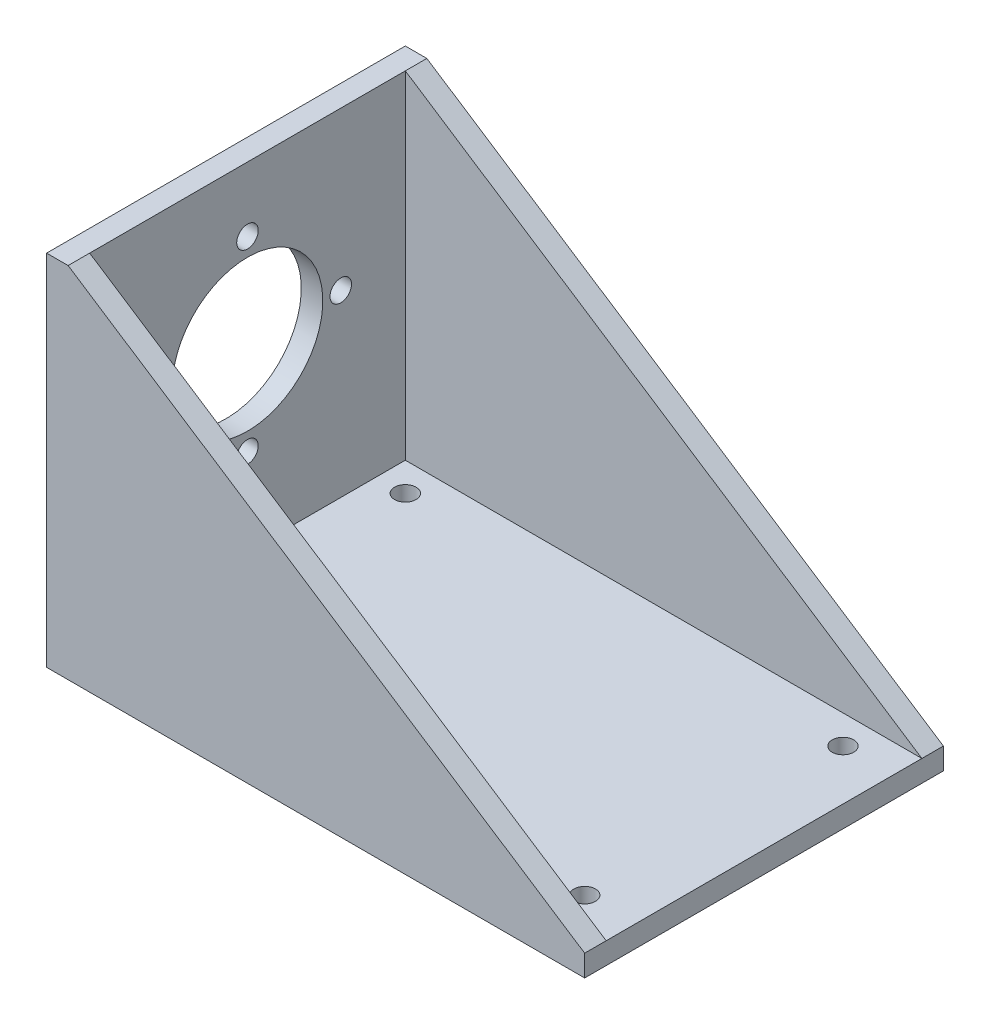
ISO-10303-21;
HEADER;
FILE_DESCRIPTION(('STEP AP214'),'2;1');
FILE_NAME('part.step','',(''),(''),'','','');
FILE_SCHEMA(('AUTOMOTIVE_DESIGN { 1 0 10303 214 1 1 1 1 }'));
ENDSEC;
DATA;
#1=APPLICATION_CONTEXT('core data for automotive mechanical design processes');
#2=APPLICATION_PROTOCOL_DEFINITION('international standard','automotive_design',2000,#1);
#3=PRODUCT_CONTEXT('',#1,'mechanical');
#4=PRODUCT('Part','Part','',(#3));
#5=PRODUCT_RELATED_PRODUCT_CATEGORY('part','',(#4));
#6=PRODUCT_DEFINITION_FORMATION('','',#4);
#7=PRODUCT_DEFINITION_CONTEXT('part definition',#1,'design');
#8=PRODUCT_DEFINITION('design','',#6,#7);
#9=PRODUCT_DEFINITION_SHAPE('','',#8);
#10=(LENGTH_UNIT() NAMED_UNIT(*) SI_UNIT(.MILLI.,.METRE.));
#11=(NAMED_UNIT(*) PLANE_ANGLE_UNIT() SI_UNIT($,.RADIAN.));
#12=(NAMED_UNIT(*) SI_UNIT($,.STERADIAN.) SOLID_ANGLE_UNIT());
#13=UNCERTAINTY_MEASURE_WITH_UNIT(LENGTH_MEASURE(1.E-05),#10,'distance_accuracy_value','');
#14=(GEOMETRIC_REPRESENTATION_CONTEXT(3) GLOBAL_UNCERTAINTY_ASSIGNED_CONTEXT((#13)) GLOBAL_UNIT_ASSIGNED_CONTEXT((#10,
#11,#12)) REPRESENTATION_CONTEXT('',''));
#15=CARTESIAN_POINT('',(0.,0.,0.));
#16=DIRECTION('',(0.,0.,1.));
#17=DIRECTION('',(1.,0.,0.));
#18=AXIS2_PLACEMENT_3D('',#15,#16,#17);
#19=CARTESIAN_POINT('',(0.,3.,0.));
#20=DIRECTION('',(0.,-1.,0.));
#21=DIRECTION('',(0.,0.,-1.));
#22=AXIS2_PLACEMENT_3D('',#19,#20,#21);
#23=PLANE('',#22);
#24=CARTESIAN_POINT('',(68.,3.,-43.));
#25=DIRECTION('',(0.,1.,0.));
#26=DIRECTION('',(0.,0.,1.));
#27=AXIS2_PLACEMENT_3D('',#24,#25,#26);
#28=CIRCLE('',#27,1.5);
#29=CARTESIAN_POINT('',(68.,3.,-41.5));
#30=VERTEX_POINT('',#29);
#31=EDGE_CURVE('E234',#30,#30,#28,.T.);
#32=ORIENTED_EDGE('',*,*,#31,.F.);
#33=EDGE_LOOP('',(#32));
#34=FACE_BOUND('',#33,.T.);
#35=CARTESIAN_POINT('',(68.,3.,-7.));
#36=DIRECTION('',(0.,1.,0.));
#37=DIRECTION('',(0.,0.,1.));
#38=AXIS2_PLACEMENT_3D('',#35,#36,#37);
#39=CIRCLE('',#38,1.5);
#40=CARTESIAN_POINT('',(68.,3.,-5.5));
#41=VERTEX_POINT('',#40);
#42=EDGE_CURVE('E228',#41,#41,#39,.T.);
#43=ORIENTED_EDGE('',*,*,#42,.F.);
#44=EDGE_LOOP('',(#43));
#45=FACE_BOUND('',#44,.T.);
#46=CARTESIAN_POINT('',(7.00000000000001,3.,-7.));
#47=DIRECTION('',(0.,1.,0.));
#48=DIRECTION('',(0.,0.,1.));
#49=AXIS2_PLACEMENT_3D('',#46,#47,#48);
#50=CIRCLE('',#49,1.5);
#51=CARTESIAN_POINT('',(7.00000000000001,3.,-5.5));
#52=VERTEX_POINT('',#51);
#53=EDGE_CURVE('E222',#52,#52,#50,.T.);
#54=ORIENTED_EDGE('',*,*,#53,.F.);
#55=EDGE_LOOP('',(#54));
#56=FACE_BOUND('',#55,.T.);
#57=CARTESIAN_POINT('',(7.,3.,-43.));
#58=DIRECTION('',(0.,1.,0.));
#59=DIRECTION('',(0.,0.,1.));
#60=AXIS2_PLACEMENT_3D('',#57,#58,#59);
#61=CIRCLE('',#60,1.5);
#62=CARTESIAN_POINT('',(7.,3.,-41.5));
#63=VERTEX_POINT('',#62);
#64=EDGE_CURVE('E216',#63,#63,#61,.T.);
#65=ORIENTED_EDGE('',*,*,#64,.F.);
#66=EDGE_LOOP('',(#65));
#67=FACE_BOUND('',#66,.T.);
#68=DIRECTION('',(0.,0.,-1.));
#69=VECTOR('',#68,1.);
#70=CARTESIAN_POINT('',(75.,3.,0.));
#71=LINE('',#70,#69);
#72=CARTESIAN_POINT('',(75.,3.,-3.));
#73=VERTEX_POINT('',#72);
#74=CARTESIAN_POINT('',(75.,3.,-47.));
#75=VERTEX_POINT('',#74);
#76=EDGE_CURVE('E125',#73,#75,#71,.T.);
#77=ORIENTED_EDGE('',*,*,#76,.T.);
#78=DIRECTION('',(-1.,0.,0.));
#79=VECTOR('',#78,1.);
#80=CARTESIAN_POINT('',(75.,3.,-47.));
#81=LINE('',#80,#79);
#82=CARTESIAN_POINT('',(3.,3.,-47.));
#83=VERTEX_POINT('',#82);
#84=EDGE_CURVE('E100',#75,#83,#81,.T.);
#85=ORIENTED_EDGE('',*,*,#84,.T.);
#86=DIRECTION('',(0.,0.,-1.));
#87=VECTOR('',#86,1.);
#88=CARTESIAN_POINT('',(3.,3.,0.));
#89=LINE('',#88,#87);
#90=CARTESIAN_POINT('',(3.,3.,-3.));
#91=VERTEX_POINT('',#90);
#92=EDGE_CURVE('E137',#91,#83,#89,.T.);
#93=ORIENTED_EDGE('',*,*,#92,.F.);
#94=DIRECTION('',(1.,0.,0.));
#95=VECTOR('',#94,1.);
#96=CARTESIAN_POINT('',(75.,3.,-3.));
#97=LINE('',#96,#95);
#98=EDGE_CURVE('E129',#91,#73,#97,.T.);
#99=ORIENTED_EDGE('',*,*,#98,.T.);
#100=EDGE_LOOP('',(#77,#85,#93,#99));
#101=FACE_BOUND('',#100,.T.);
#102=ADVANCED_FACE('F34',(#34,#45,#56,#67,#101),#23,.F.);
#103=CARTESIAN_POINT('',(3.,50.,0.));
#104=DIRECTION('',(-1.,0.,0.));
#105=DIRECTION('',(0.,0.,1.));
#106=AXIS2_PLACEMENT_3D('',#103,#104,#105);
#107=PLANE('',#106);
#108=CARTESIAN_POINT('',(3.,28.,-25.));
#109=DIRECTION('',(-1.,0.,0.));
#110=DIRECTION('',(0.,0.,1.));
#111=AXIS2_PLACEMENT_3D('',#108,#109,#110);
#112=CIRCLE('',#111,10.5);
#113=CARTESIAN_POINT('',(3.,28.,-14.5));
#114=VERTEX_POINT('',#113);
#115=EDGE_CURVE('E178',#114,#114,#112,.T.);
#116=ORIENTED_EDGE('',*,*,#115,.T.);
#117=EDGE_LOOP('',(#116));
#118=FACE_BOUND('',#117,.T.);
#119=CARTESIAN_POINT('',(3.,28.,-12.));
#120=DIRECTION('',(-1.,0.,0.));
#121=DIRECTION('',(0.,0.,1.));
#122=AXIS2_PLACEMENT_3D('',#119,#120,#121);
#123=CIRCLE('',#122,1.5);
#124=CARTESIAN_POINT('',(3.,28.,-10.5));
#125=VERTEX_POINT('',#124);
#126=EDGE_CURVE('E179',#125,#125,#123,.T.);
#127=ORIENTED_EDGE('',*,*,#126,.T.);
#128=EDGE_LOOP('',(#127));
#129=FACE_BOUND('',#128,.T.);
#130=CARTESIAN_POINT('',(3.,15.,-25.));
#131=DIRECTION('',(-1.,0.,0.));
#132=DIRECTION('',(0.,0.,1.));
#133=AXIS2_PLACEMENT_3D('',#130,#131,#132);
#134=CIRCLE('',#133,1.5);
#135=CARTESIAN_POINT('',(3.,15.,-23.5));
#136=VERTEX_POINT('',#135);
#137=EDGE_CURVE('E185',#136,#136,#134,.T.);
#138=ORIENTED_EDGE('',*,*,#137,.T.);
#139=EDGE_LOOP('',(#138));
#140=FACE_BOUND('',#139,.T.);
#141=CARTESIAN_POINT('',(3.,28.0000000000001,-38.));
#142=DIRECTION('',(-1.,0.,0.));
#143=DIRECTION('',(0.,0.,1.));
#144=AXIS2_PLACEMENT_3D('',#141,#142,#143);
#145=CIRCLE('',#144,1.5);
#146=CARTESIAN_POINT('',(3.,28.0000000000001,-36.5));
#147=VERTEX_POINT('',#146);
#148=EDGE_CURVE('E186',#147,#147,#145,.T.);
#149=ORIENTED_EDGE('',*,*,#148,.T.);
#150=EDGE_LOOP('',(#149));
#151=FACE_BOUND('',#150,.T.);
#152=CARTESIAN_POINT('',(3.,41.,-24.9999999999999));
#153=DIRECTION('',(-1.,0.,0.));
#154=DIRECTION('',(0.,0.,1.));
#155=AXIS2_PLACEMENT_3D('',#152,#153,#154);
#156=CIRCLE('',#155,1.50000000000001);
#157=CARTESIAN_POINT('',(3.,41.,-23.4999999999999));
#158=VERTEX_POINT('',#157);
#159=EDGE_CURVE('E197',#158,#158,#156,.T.);
#160=ORIENTED_EDGE('',*,*,#159,.T.);
#161=EDGE_LOOP('',(#160));
#162=FACE_BOUND('',#161,.T.);
#163=ORIENTED_EDGE('',*,*,#92,.T.);
#164=DIRECTION('',(0.,1.,0.));
#165=VECTOR('',#164,1.);
#166=CARTESIAN_POINT('',(3.,3.,-47.));
#167=LINE('',#166,#165);
#168=CARTESIAN_POINT('',(3.,50.,-47.));
#169=VERTEX_POINT('',#168);
#170=EDGE_CURVE('E105',#83,#169,#167,.T.);
#171=ORIENTED_EDGE('',*,*,#170,.T.);
#172=DIRECTION('',(0.,0.,-1.));
#173=VECTOR('',#172,1.);
#174=CARTESIAN_POINT('',(3.,50.,0.));
#175=LINE('',#174,#173);
#176=CARTESIAN_POINT('',(3.,50.,-3.));
#177=VERTEX_POINT('',#176);
#178=EDGE_CURVE('E169',#177,#169,#175,.T.);
#179=ORIENTED_EDGE('',*,*,#178,.F.);
#180=DIRECTION('',(0.,-1.,0.));
#181=VECTOR('',#180,1.);
#182=CARTESIAN_POINT('',(3.,3.,-3.));
#183=LINE('',#182,#181);
#184=EDGE_CURVE('E207',#177,#91,#183,.T.);
#185=ORIENTED_EDGE('',*,*,#184,.T.);
#186=EDGE_LOOP('',(#163,#171,#179,#185));
#187=FACE_BOUND('',#186,.T.);
#188=ADVANCED_FACE('F251',(#118,#129,#140,#151,#162,#187),#107,.F.);
#189=CARTESIAN_POINT('',(0.,3.,0.));
#190=DIRECTION('',(1.,0.,0.));
#191=DIRECTION('',(0.,0.,-1.));
#192=AXIS2_PLACEMENT_3D('',#189,#190,#191);
#193=PLANE('',#192);
#194=CARTESIAN_POINT('',(0.,41.,-24.9999999999999));
#195=DIRECTION('',(-1.,0.,0.));
#196=DIRECTION('',(0.,0.,1.));
#197=AXIS2_PLACEMENT_3D('',#194,#195,#196);
#198=CIRCLE('',#197,1.50000000000001);
#199=CARTESIAN_POINT('',(0.,41.,-23.4999999999999));
#200=VERTEX_POINT('',#199);
#201=EDGE_CURVE('E194',#200,#200,#198,.T.);
#202=ORIENTED_EDGE('',*,*,#201,.F.);
#203=EDGE_LOOP('',(#202));
#204=FACE_BOUND('',#203,.T.);
#205=CARTESIAN_POINT('',(0.,28.0000000000001,-38.));
#206=DIRECTION('',(-1.,0.,0.));
#207=DIRECTION('',(0.,0.,1.));
#208=AXIS2_PLACEMENT_3D('',#205,#206,#207);
#209=CIRCLE('',#208,1.5);
#210=CARTESIAN_POINT('',(0.,28.0000000000001,-36.5));
#211=VERTEX_POINT('',#210);
#212=EDGE_CURVE('E200',#211,#211,#209,.T.);
#213=ORIENTED_EDGE('',*,*,#212,.F.);
#214=EDGE_LOOP('',(#213));
#215=FACE_BOUND('',#214,.T.);
#216=CARTESIAN_POINT('',(0.,15.,-25.));
#217=DIRECTION('',(-1.,0.,0.));
#218=DIRECTION('',(0.,0.,1.));
#219=AXIS2_PLACEMENT_3D('',#216,#217,#218);
#220=CIRCLE('',#219,1.5);
#221=CARTESIAN_POINT('',(0.,15.,-23.5));
#222=VERTEX_POINT('',#221);
#223=EDGE_CURVE('E182',#222,#222,#220,.T.);
#224=ORIENTED_EDGE('',*,*,#223,.F.);
#225=EDGE_LOOP('',(#224));
#226=FACE_BOUND('',#225,.T.);
#227=CARTESIAN_POINT('',(0.,28.,-12.));
#228=DIRECTION('',(-1.,0.,0.));
#229=DIRECTION('',(0.,0.,1.));
#230=AXIS2_PLACEMENT_3D('',#227,#228,#229);
#231=CIRCLE('',#230,1.5);
#232=CARTESIAN_POINT('',(0.,28.,-10.5));
#233=VERTEX_POINT('',#232);
#234=EDGE_CURVE('E189',#233,#233,#231,.T.);
#235=ORIENTED_EDGE('',*,*,#234,.F.);
#236=EDGE_LOOP('',(#235));
#237=FACE_BOUND('',#236,.T.);
#238=CARTESIAN_POINT('',(0.,28.,-25.));
#239=DIRECTION('',(-1.,0.,0.));
#240=DIRECTION('',(0.,0.,1.));
#241=AXIS2_PLACEMENT_3D('',#238,#239,#240);
#242=CIRCLE('',#241,10.5);
#243=CARTESIAN_POINT('',(0.,28.,-14.5));
#244=VERTEX_POINT('',#243);
#245=EDGE_CURVE('E175',#244,#244,#242,.T.);
#246=ORIENTED_EDGE('',*,*,#245,.F.);
#247=EDGE_LOOP('',(#246));
#248=FACE_BOUND('',#247,.T.);
#249=DIRECTION('',(0.,0.,1.));
#250=VECTOR('',#249,1.);
#251=CARTESIAN_POINT('',(0.,0.,0.));
#252=LINE('',#251,#250);
#253=CARTESIAN_POINT('',(0.,0.,-50.));
#254=VERTEX_POINT('',#253);
#255=CARTESIAN_POINT('',(0.,0.,0.));
#256=VERTEX_POINT('',#255);
#257=EDGE_CURVE('E139',#254,#256,#252,.T.);
#258=ORIENTED_EDGE('',*,*,#257,.T.);
#259=DIRECTION('',(0.,-1.,0.));
#260=VECTOR('',#259,1.);
#261=CARTESIAN_POINT('',(0.,3.,0.));
#262=LINE('',#261,#260);
#263=CARTESIAN_POINT('',(0.,50.,0.));
#264=VERTEX_POINT('',#263);
#265=EDGE_CURVE('E11',#264,#256,#262,.T.);
#266=ORIENTED_EDGE('',*,*,#265,.F.);
#267=DIRECTION('',(0.,0.,1.));
#268=VECTOR('',#267,1.);
#269=CARTESIAN_POINT('',(0.,50.,0.));
#270=LINE('',#269,#268);
#271=CARTESIAN_POINT('',(0.,50.,-50.));
#272=VERTEX_POINT('',#271);
#273=EDGE_CURVE('E159',#272,#264,#270,.T.);
#274=ORIENTED_EDGE('',*,*,#273,.F.);
#275=DIRECTION('',(0.,-1.,0.));
#276=VECTOR('',#275,1.);
#277=CARTESIAN_POINT('',(0.,3.,-50.));
#278=LINE('',#277,#276);
#279=EDGE_CURVE('E132',#272,#254,#278,.T.);
#280=ORIENTED_EDGE('',*,*,#279,.T.);
#281=EDGE_LOOP('',(#258,#266,#274,#280));
#282=FACE_BOUND('',#281,.T.);
#283=ADVANCED_FACE('F36',(#204,#215,#226,#237,#248,#282),#193,.F.);
#284=CARTESIAN_POINT('',(0.,3.,0.));
#285=DIRECTION('',(0.,0.,-1.));
#286=DIRECTION('',(-1.,0.,0.));
#287=AXIS2_PLACEMENT_3D('',#284,#285,#286);
#288=PLANE('',#287);
#289=DIRECTION('',(0.,-1.,0.));
#290=VECTOR('',#289,1.);
#291=CARTESIAN_POINT('',(75.,3.,0.));
#292=LINE('',#291,#290);
#293=CARTESIAN_POINT('',(75.,3.,0.));
#294=VERTEX_POINT('',#293);
#295=CARTESIAN_POINT('',(75.,0.,0.));
#296=VERTEX_POINT('',#295);
#297=EDGE_CURVE('E42',#294,#296,#292,.T.);
#298=ORIENTED_EDGE('',*,*,#297,.F.);
#299=DIRECTION('',(-0.837379150368376,0.546622500934912,0.));
#300=VECTOR('',#299,1.);
#301=CARTESIAN_POINT('',(3.,50.,0.));
#302=LINE('',#301,#300);
#303=CARTESIAN_POINT('',(3.,50.,0.));
#304=VERTEX_POINT('',#303);
#305=EDGE_CURVE('E205',#294,#304,#302,.T.);
#306=ORIENTED_EDGE('',*,*,#305,.T.);
#307=DIRECTION('',(1.,0.,0.));
#308=VECTOR('',#307,1.);
#309=CARTESIAN_POINT('',(0.,50.,0.));
#310=LINE('',#309,#308);
#311=EDGE_CURVE('E172',#264,#304,#310,.T.);
#312=ORIENTED_EDGE('',*,*,#311,.F.);
#313=ORIENTED_EDGE('',*,*,#265,.T.);
#314=DIRECTION('',(1.,0.,0.));
#315=VECTOR('',#314,1.);
#316=CARTESIAN_POINT('',(0.,0.,0.));
#317=LINE('',#316,#315);
#318=EDGE_CURVE('E142',#256,#296,#317,.T.);
#319=ORIENTED_EDGE('',*,*,#318,.T.);
#320=EDGE_LOOP('',(#298,#306,#312,#313,#319));
#321=FACE_BOUND('',#320,.T.);
#322=ADVANCED_FACE('F313',(#321),#288,.F.);
#323=CARTESIAN_POINT('',(75.,3.,0.));
#324=DIRECTION('',(-1.,0.,0.));
#325=DIRECTION('',(0.,0.,1.));
#326=AXIS2_PLACEMENT_3D('',#323,#324,#325);
#327=PLANE('',#326);
#328=DIRECTION('',(0.,0.,-1.));
#329=VECTOR('',#328,1.);
#330=CARTESIAN_POINT('',(75.,0.,0.));
#331=LINE('',#330,#329);
#332=CARTESIAN_POINT('',(75.,0.,-50.));
#333=VERTEX_POINT('',#332);
#334=EDGE_CURVE('E133',#296,#333,#331,.T.);
#335=ORIENTED_EDGE('',*,*,#334,.T.);
#336=DIRECTION('',(0.,-1.,0.));
#337=VECTOR('',#336,1.);
#338=CARTESIAN_POINT('',(75.,3.,-50.));
#339=LINE('',#338,#337);
#340=CARTESIAN_POINT('',(75.,3.,-50.));
#341=VERTEX_POINT('',#340);
#342=EDGE_CURVE('E126',#341,#333,#339,.T.);
#343=ORIENTED_EDGE('',*,*,#342,.F.);
#344=DIRECTION('',(0.,0.,-1.));
#345=VECTOR('',#344,1.);
#346=CARTESIAN_POINT('',(75.,3.,-47.));
#347=LINE('',#346,#345);
#348=EDGE_CURVE('E114',#75,#341,#347,.T.);
#349=ORIENTED_EDGE('',*,*,#348,.F.);
#350=ORIENTED_EDGE('',*,*,#76,.F.);
#351=EDGE_CURVE('E130',#294,#73,#71,.T.);
#352=ORIENTED_EDGE('',*,*,#351,.F.);
#353=ORIENTED_EDGE('',*,*,#297,.T.);
#354=EDGE_LOOP('',(#335,#343,#349,#350,#352,#353));
#355=FACE_BOUND('',#354,.T.);
#356=ADVANCED_FACE('F123',(#355),#327,.F.);
#357=CARTESIAN_POINT('',(0.,3.,-50.));
#358=DIRECTION('',(0.,0.,1.));
#359=DIRECTION('',(1.,0.,0.));
#360=AXIS2_PLACEMENT_3D('',#357,#358,#359);
#361=PLANE('',#360);
#362=DIRECTION('',(-1.,0.,0.));
#363=VECTOR('',#362,1.);
#364=CARTESIAN_POINT('',(0.,0.,-50.));
#365=LINE('',#364,#363);
#366=EDGE_CURVE('E57',#333,#254,#365,.T.);
#367=ORIENTED_EDGE('',*,*,#366,.T.);
#368=ORIENTED_EDGE('',*,*,#279,.F.);
#369=DIRECTION('',(-1.,0.,0.));
#370=VECTOR('',#369,1.);
#371=CARTESIAN_POINT('',(0.,50.,-50.));
#372=LINE('',#371,#370);
#373=CARTESIAN_POINT('',(3.,50.,-50.));
#374=VERTEX_POINT('',#373);
#375=EDGE_CURVE('E143',#374,#272,#372,.T.);
#376=ORIENTED_EDGE('',*,*,#375,.F.);
#377=DIRECTION('',(0.837379150368376,-0.546622500934912,0.));
#378=VECTOR('',#377,1.);
#379=CARTESIAN_POINT('',(3.,50.,-50.));
#380=LINE('',#379,#378);
#381=EDGE_CURVE('E118',#374,#341,#380,.T.);
#382=ORIENTED_EDGE('',*,*,#381,.T.);
#383=ORIENTED_EDGE('',*,*,#342,.T.);
#384=EDGE_LOOP('',(#367,#368,#376,#382,#383));
#385=FACE_BOUND('',#384,.T.);
#386=ADVANCED_FACE('F162',(#385),#361,.F.);
#387=CARTESIAN_POINT('',(0.,0.,0.));
#388=DIRECTION('',(0.,-1.,0.));
#389=DIRECTION('',(0.,0.,-1.));
#390=AXIS2_PLACEMENT_3D('',#387,#388,#389);
#391=PLANE('',#390);
#392=CARTESIAN_POINT('',(68.,0.,-43.));
#393=DIRECTION('',(0.,1.,0.));
#394=DIRECTION('',(0.,0.,1.));
#395=AXIS2_PLACEMENT_3D('',#392,#393,#394);
#396=CIRCLE('',#395,1.5);
#397=CARTESIAN_POINT('',(68.,0.,-41.5));
#398=VERTEX_POINT('',#397);
#399=EDGE_CURVE('E219',#398,#398,#396,.T.);
#400=ORIENTED_EDGE('',*,*,#399,.T.);
#401=EDGE_LOOP('',(#400));
#402=FACE_BOUND('',#401,.T.);
#403=CARTESIAN_POINT('',(68.,0.,-7.));
#404=DIRECTION('',(0.,1.,0.));
#405=DIRECTION('',(0.,0.,1.));
#406=AXIS2_PLACEMENT_3D('',#403,#404,#405);
#407=CIRCLE('',#406,1.5);
#408=CARTESIAN_POINT('',(68.,0.,-5.5));
#409=VERTEX_POINT('',#408);
#410=EDGE_CURVE('E231',#409,#409,#407,.T.);
#411=ORIENTED_EDGE('',*,*,#410,.T.);
#412=EDGE_LOOP('',(#411));
#413=FACE_BOUND('',#412,.T.);
#414=CARTESIAN_POINT('',(7.00000000000001,0.,-7.));
#415=DIRECTION('',(0.,1.,0.));
#416=DIRECTION('',(0.,0.,1.));
#417=AXIS2_PLACEMENT_3D('',#414,#415,#416);
#418=CIRCLE('',#417,1.5);
#419=CARTESIAN_POINT('',(7.00000000000001,0.,-5.5));
#420=VERTEX_POINT('',#419);
#421=EDGE_CURVE('E225',#420,#420,#418,.T.);
#422=ORIENTED_EDGE('',*,*,#421,.T.);
#423=EDGE_LOOP('',(#422));
#424=FACE_BOUND('',#423,.T.);
#425=CARTESIAN_POINT('',(7.,0.,-43.));
#426=DIRECTION('',(0.,1.,0.));
#427=DIRECTION('',(0.,0.,1.));
#428=AXIS2_PLACEMENT_3D('',#425,#426,#427);
#429=CIRCLE('',#428,1.5);
#430=CARTESIAN_POINT('',(7.,0.,-41.5));
#431=VERTEX_POINT('',#430);
#432=EDGE_CURVE('E214',#431,#431,#429,.T.);
#433=ORIENTED_EDGE('',*,*,#432,.T.);
#434=EDGE_LOOP('',(#433));
#435=FACE_BOUND('',#434,.T.);
#436=ORIENTED_EDGE('',*,*,#257,.F.);
#437=ORIENTED_EDGE('',*,*,#366,.F.);
#438=ORIENTED_EDGE('',*,*,#334,.F.);
#439=ORIENTED_EDGE('',*,*,#318,.F.);
#440=EDGE_LOOP('',(#436,#437,#438,#439));
#441=FACE_BOUND('',#440,.T.);
#442=ADVANCED_FACE('F154',(#402,#413,#424,#435,#441),#391,.T.);
#443=CARTESIAN_POINT('',(0.,50.,0.));
#444=DIRECTION('',(0.,-1.,0.));
#445=DIRECTION('',(0.,0.,-1.));
#446=AXIS2_PLACEMENT_3D('',#443,#444,#445);
#447=PLANE('',#446);
#448=ORIENTED_EDGE('',*,*,#273,.T.);
#449=ORIENTED_EDGE('',*,*,#311,.T.);
#450=EDGE_CURVE('E167',#304,#177,#175,.T.);
#451=ORIENTED_EDGE('',*,*,#450,.T.);
#452=ORIENTED_EDGE('',*,*,#178,.T.);
#453=DIRECTION('',(0.,0.,-1.));
#454=VECTOR('',#453,1.);
#455=CARTESIAN_POINT('',(3.,50.,-47.));
#456=LINE('',#455,#454);
#457=EDGE_CURVE('E117',#169,#374,#456,.T.);
#458=ORIENTED_EDGE('',*,*,#457,.T.);
#459=ORIENTED_EDGE('',*,*,#375,.T.);
#460=EDGE_LOOP('',(#448,#449,#451,#452,#458,#459));
#461=FACE_BOUND('',#460,.T.);
#462=ADVANCED_FACE('F164',(#461),#447,.F.);
#463=CARTESIAN_POINT('',(3.,28.,-25.));
#464=DIRECTION('',(-1.,0.,0.));
#465=DIRECTION('',(0.,0.,1.));
#466=AXIS2_PLACEMENT_3D('',#463,#464,#465);
#467=CYLINDRICAL_SURFACE('',#466,10.5);
#468=ORIENTED_EDGE('',*,*,#115,.F.);
#469=EDGE_LOOP('',(#468));
#470=FACE_BOUND('',#469,.T.);
#471=ORIENTED_EDGE('',*,*,#245,.T.);
#472=EDGE_LOOP('',(#471));
#473=FACE_BOUND('',#472,.T.);
#474=ADVANCED_FACE('F295',(#470,#473),#467,.F.);
#475=CARTESIAN_POINT('',(3.,28.,-12.));
#476=DIRECTION('',(-1.,0.,0.));
#477=DIRECTION('',(0.,0.,1.));
#478=AXIS2_PLACEMENT_3D('',#475,#476,#477);
#479=CYLINDRICAL_SURFACE('',#478,1.5);
#480=ORIENTED_EDGE('',*,*,#126,.F.);
#481=EDGE_LOOP('',(#480));
#482=FACE_BOUND('',#481,.T.);
#483=ORIENTED_EDGE('',*,*,#234,.T.);
#484=EDGE_LOOP('',(#483));
#485=FACE_BOUND('',#484,.T.);
#486=ADVANCED_FACE('F292',(#482,#485),#479,.F.);
#487=CARTESIAN_POINT('',(3.,15.,-25.));
#488=DIRECTION('',(-1.,0.,0.));
#489=DIRECTION('',(0.,0.,1.));
#490=AXIS2_PLACEMENT_3D('',#487,#488,#489);
#491=CYLINDRICAL_SURFACE('',#490,1.5);
#492=ORIENTED_EDGE('',*,*,#137,.F.);
#493=EDGE_LOOP('',(#492));
#494=FACE_BOUND('',#493,.T.);
#495=ORIENTED_EDGE('',*,*,#223,.T.);
#496=EDGE_LOOP('',(#495));
#497=FACE_BOUND('',#496,.T.);
#498=ADVANCED_FACE('F287',(#494,#497),#491,.F.);
#499=CARTESIAN_POINT('',(3.,28.0000000000001,-38.));
#500=DIRECTION('',(-1.,0.,0.));
#501=DIRECTION('',(0.,0.,1.));
#502=AXIS2_PLACEMENT_3D('',#499,#500,#501);
#503=CYLINDRICAL_SURFACE('',#502,1.5);
#504=ORIENTED_EDGE('',*,*,#148,.F.);
#505=EDGE_LOOP('',(#504));
#506=FACE_BOUND('',#505,.T.);
#507=ORIENTED_EDGE('',*,*,#212,.T.);
#508=EDGE_LOOP('',(#507));
#509=FACE_BOUND('',#508,.T.);
#510=ADVANCED_FACE('F284',(#506,#509),#503,.F.);
#511=CARTESIAN_POINT('',(3.,41.,-24.9999999999999));
#512=DIRECTION('',(-1.,0.,0.));
#513=DIRECTION('',(0.,0.,1.));
#514=AXIS2_PLACEMENT_3D('',#511,#512,#513);
#515=CYLINDRICAL_SURFACE('',#514,1.50000000000001);
#516=ORIENTED_EDGE('',*,*,#159,.F.);
#517=EDGE_LOOP('',(#516));
#518=FACE_BOUND('',#517,.T.);
#519=ORIENTED_EDGE('',*,*,#201,.T.);
#520=EDGE_LOOP('',(#519));
#521=FACE_BOUND('',#520,.T.);
#522=ADVANCED_FACE('F283',(#518,#521),#515,.F.);
#523=CARTESIAN_POINT('',(3.,50.,-3.));
#524=DIRECTION('',(0.546622500934912,0.837379150368375,0.));
#525=DIRECTION('',(-0.837379150368376,0.546622500934912,0.));
#526=AXIS2_PLACEMENT_3D('',#523,#524,#525);
#527=PLANE('',#526);
#528=ORIENTED_EDGE('',*,*,#305,.F.);
#529=ORIENTED_EDGE('',*,*,#351,.T.);
#530=DIRECTION('',(-0.837379150368376,0.546622500934912,0.));
#531=VECTOR('',#530,1.);
#532=CARTESIAN_POINT('',(3.,50.,-3.));
#533=LINE('',#532,#531);
#534=EDGE_CURVE('E49',#73,#177,#533,.T.);
#535=ORIENTED_EDGE('',*,*,#534,.T.);
#536=ORIENTED_EDGE('',*,*,#450,.F.);
#537=EDGE_LOOP('',(#528,#529,#535,#536));
#538=FACE_BOUND('',#537,.T.);
#539=ADVANCED_FACE('F279',(#538),#527,.T.);
#540=CARTESIAN_POINT('',(0.,0.,-3.));
#541=DIRECTION('',(0.,0.,1.));
#542=DIRECTION('',(1.,0.,0.));
#543=AXIS2_PLACEMENT_3D('',#540,#541,#542);
#544=PLANE('',#543);
#545=ORIENTED_EDGE('',*,*,#184,.F.);
#546=ORIENTED_EDGE('',*,*,#534,.F.);
#547=ORIENTED_EDGE('',*,*,#98,.F.);
#548=EDGE_LOOP('',(#545,#546,#547));
#549=FACE_BOUND('',#548,.T.);
#550=ADVANCED_FACE('F276',(#549),#544,.F.);
#551=CARTESIAN_POINT('',(3.,50.,-47.));
#552=DIRECTION('',(0.546622500934912,0.837379150368375,0.));
#553=DIRECTION('',(-0.837379150368376,0.546622500934912,0.));
#554=AXIS2_PLACEMENT_3D('',#551,#552,#553);
#555=PLANE('',#554);
#556=ORIENTED_EDGE('',*,*,#381,.F.);
#557=ORIENTED_EDGE('',*,*,#457,.F.);
#558=DIRECTION('',(0.837379150368376,-0.546622500934912,0.));
#559=VECTOR('',#558,1.);
#560=CARTESIAN_POINT('',(3.,50.,-47.));
#561=LINE('',#560,#559);
#562=EDGE_CURVE('E103',#169,#75,#561,.T.);
#563=ORIENTED_EDGE('',*,*,#562,.T.);
#564=ORIENTED_EDGE('',*,*,#348,.T.);
#565=EDGE_LOOP('',(#556,#557,#563,#564));
#566=FACE_BOUND('',#565,.T.);
#567=ADVANCED_FACE('F113',(#566),#555,.T.);
#568=CARTESIAN_POINT('',(0.,0.,-47.));
#569=DIRECTION('',(0.,0.,1.));
#570=DIRECTION('',(1.,0.,0.));
#571=AXIS2_PLACEMENT_3D('',#568,#569,#570);
#572=PLANE('',#571);
#573=ORIENTED_EDGE('',*,*,#562,.F.);
#574=ORIENTED_EDGE('',*,*,#170,.F.);
#575=ORIENTED_EDGE('',*,*,#84,.F.);
#576=EDGE_LOOP('',(#573,#574,#575));
#577=FACE_BOUND('',#576,.T.);
#578=ADVANCED_FACE('F102',(#577),#572,.T.);
#579=CARTESIAN_POINT('',(7.,0.,-43.));
#580=DIRECTION('',(0.,1.,0.));
#581=DIRECTION('',(0.,0.,1.));
#582=AXIS2_PLACEMENT_3D('',#579,#580,#581);
#583=CYLINDRICAL_SURFACE('',#582,1.5);
#584=ORIENTED_EDGE('',*,*,#432,.F.);
#585=EDGE_LOOP('',(#584));
#586=FACE_BOUND('',#585,.T.);
#587=ORIENTED_EDGE('',*,*,#64,.T.);
#588=EDGE_LOOP('',(#587));
#589=FACE_BOUND('',#588,.T.);
#590=ADVANCED_FACE('F259',(#586,#589),#583,.F.);
#591=CARTESIAN_POINT('',(7.00000000000001,0.,-7.));
#592=DIRECTION('',(0.,1.,0.));
#593=DIRECTION('',(0.,0.,1.));
#594=AXIS2_PLACEMENT_3D('',#591,#592,#593);
#595=CYLINDRICAL_SURFACE('',#594,1.5);
#596=ORIENTED_EDGE('',*,*,#421,.F.);
#597=EDGE_LOOP('',(#596));
#598=FACE_BOUND('',#597,.T.);
#599=ORIENTED_EDGE('',*,*,#53,.T.);
#600=EDGE_LOOP('',(#599));
#601=FACE_BOUND('',#600,.T.);
#602=ADVANCED_FACE('F261',(#598,#601),#595,.F.);
#603=CARTESIAN_POINT('',(68.,0.,-7.));
#604=DIRECTION('',(0.,1.,0.));
#605=DIRECTION('',(0.,0.,1.));
#606=AXIS2_PLACEMENT_3D('',#603,#604,#605);
#607=CYLINDRICAL_SURFACE('',#606,1.5);
#608=ORIENTED_EDGE('',*,*,#410,.F.);
#609=EDGE_LOOP('',(#608));
#610=FACE_BOUND('',#609,.T.);
#611=ORIENTED_EDGE('',*,*,#42,.T.);
#612=EDGE_LOOP('',(#611));
#613=FACE_BOUND('',#612,.T.);
#614=ADVANCED_FACE('F245',(#610,#613),#607,.F.);
#615=CARTESIAN_POINT('',(68.,0.,-43.));
#616=DIRECTION('',(0.,1.,0.));
#617=DIRECTION('',(0.,0.,1.));
#618=AXIS2_PLACEMENT_3D('',#615,#616,#617);
#619=CYLINDRICAL_SURFACE('',#618,1.5);
#620=ORIENTED_EDGE('',*,*,#399,.F.);
#621=EDGE_LOOP('',(#620));
#622=FACE_BOUND('',#621,.T.);
#623=ORIENTED_EDGE('',*,*,#31,.T.);
#624=EDGE_LOOP('',(#623));
#625=FACE_BOUND('',#624,.T.);
#626=ADVANCED_FACE('F242',(#622,#625),#619,.F.);
#627=CLOSED_SHELL('',(#102,#188,#283,#322,#356,#386,#442,#462,#474,#486,#498,#510,#522,#539,
#550,#567,#578,#590,#602,#614,#626));
#628=MANIFOLD_SOLID_BREP('B2',#627);
#629=ADVANCED_BREP_SHAPE_REPRESENTATION('',(#18,#628),#14);
#630=SHAPE_DEFINITION_REPRESENTATION(#9,#629);
ENDSEC;
END-ISO-10303-21;
